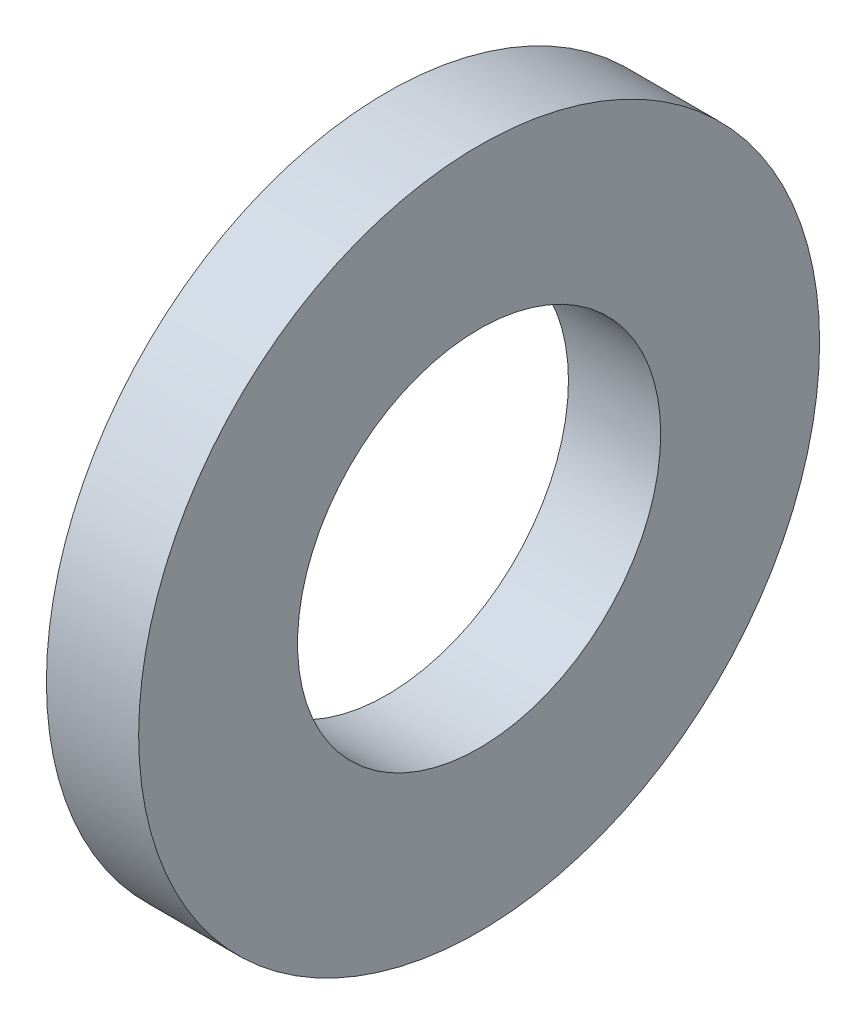
ISO-10303-21;
HEADER;
FILE_DESCRIPTION(('STEP AP214'),'2;1');
FILE_NAME('part.step','',(''),(''),'','','');
FILE_SCHEMA(('AUTOMOTIVE_DESIGN { 1 0 10303 214 1 1 1 1 }'));
ENDSEC;
DATA;
#1=APPLICATION_CONTEXT('core data for automotive mechanical design processes');
#2=APPLICATION_PROTOCOL_DEFINITION('international standard','automotive_design',2000,#1);
#3=PRODUCT_CONTEXT('',#1,'mechanical');
#4=PRODUCT('Part','Part','',(#3));
#5=PRODUCT_RELATED_PRODUCT_CATEGORY('part','',(#4));
#6=PRODUCT_DEFINITION_FORMATION('','',#4);
#7=PRODUCT_DEFINITION_CONTEXT('part definition',#1,'design');
#8=PRODUCT_DEFINITION('design','',#6,#7);
#9=PRODUCT_DEFINITION_SHAPE('','',#8);
#10=(LENGTH_UNIT() NAMED_UNIT(*) SI_UNIT(.MILLI.,.METRE.));
#11=(NAMED_UNIT(*) PLANE_ANGLE_UNIT() SI_UNIT($,.RADIAN.));
#12=(NAMED_UNIT(*) SI_UNIT($,.STERADIAN.) SOLID_ANGLE_UNIT());
#13=UNCERTAINTY_MEASURE_WITH_UNIT(LENGTH_MEASURE(1.E-05),#10,'distance_accuracy_value','');
#14=(GEOMETRIC_REPRESENTATION_CONTEXT(3) GLOBAL_UNCERTAINTY_ASSIGNED_CONTEXT((#13)) GLOBAL_UNIT_ASSIGNED_CONTEXT((#10,
#11,#12)) REPRESENTATION_CONTEXT('',''));
#15=CARTESIAN_POINT('',(0.,0.,0.));
#16=DIRECTION('',(0.,0.,1.));
#17=DIRECTION('',(1.,0.,0.));
#18=AXIS2_PLACEMENT_3D('',#15,#16,#17);
#19=CARTESIAN_POINT('',(0.8128,0.,0.));
#20=DIRECTION('',(1.,0.,0.));
#21=DIRECTION('',(0.,0.,-1.));
#22=AXIS2_PLACEMENT_3D('',#19,#20,#21);
#23=PLANE('',#22);
#24=CARTESIAN_POINT('',(0.8128,0.,0.));
#25=DIRECTION('',(1.,0.,0.));
#26=DIRECTION('',(0.,0.,-1.));
#27=AXIS2_PLACEMENT_3D('',#24,#25,#26);
#28=CIRCLE('',#27,3.);
#29=CARTESIAN_POINT('',(0.8128,0.,-3.));
#30=VERTEX_POINT('',#29);
#31=EDGE_CURVE('E10',#30,#30,#28,.T.);
#32=ORIENTED_EDGE('',*,*,#31,.T.);
#33=EDGE_LOOP('',(#32));
#34=FACE_BOUND('',#33,.T.);
#35=CARTESIAN_POINT('',(0.8128,0.,0.));
#36=DIRECTION('',(1.,0.,0.));
#37=DIRECTION('',(0.,0.,-1.));
#38=AXIS2_PLACEMENT_3D('',#35,#36,#37);
#39=CIRCLE('',#38,1.6);
#40=CARTESIAN_POINT('',(0.8128,0.,-1.6));
#41=VERTEX_POINT('',#40);
#42=EDGE_CURVE('E47',#41,#41,#39,.T.);
#43=ORIENTED_EDGE('',*,*,#42,.F.);
#44=EDGE_LOOP('',(#43));
#45=FACE_BOUND('',#44,.T.);
#46=ADVANCED_FACE('F36',(#34,#45),#23,.T.);
#47=CARTESIAN_POINT('',(0.,0.,0.));
#48=DIRECTION('',(1.,0.,0.));
#49=DIRECTION('',(0.,0.,-1.));
#50=AXIS2_PLACEMENT_3D('',#47,#48,#49);
#51=PLANE('',#50);
#52=CARTESIAN_POINT('',(0.,0.,0.));
#53=DIRECTION('',(1.,0.,0.));
#54=DIRECTION('',(0.,0.,-1.));
#55=AXIS2_PLACEMENT_3D('',#52,#53,#54);
#56=CIRCLE('',#55,3.);
#57=CARTESIAN_POINT('',(0.,0.,-3.));
#58=VERTEX_POINT('',#57);
#59=EDGE_CURVE('E40',#58,#58,#56,.T.);
#60=ORIENTED_EDGE('',*,*,#59,.F.);
#61=EDGE_LOOP('',(#60));
#62=FACE_BOUND('',#61,.T.);
#63=CARTESIAN_POINT('',(0.,0.,0.));
#64=DIRECTION('',(1.,0.,0.));
#65=DIRECTION('',(0.,0.,-1.));
#66=AXIS2_PLACEMENT_3D('',#63,#64,#65);
#67=CIRCLE('',#66,1.6);
#68=CARTESIAN_POINT('',(0.,0.,-1.6));
#69=VERTEX_POINT('',#68);
#70=EDGE_CURVE('E49',#69,#69,#67,.T.);
#71=ORIENTED_EDGE('',*,*,#70,.T.);
#72=EDGE_LOOP('',(#71));
#73=FACE_BOUND('',#72,.T.);
#74=ADVANCED_FACE('F59',(#62,#73),#51,.F.);
#75=CARTESIAN_POINT('',(0.8128,0.,0.));
#76=DIRECTION('',(-1.,0.,0.));
#77=DIRECTION('',(0.,0.,1.));
#78=AXIS2_PLACEMENT_3D('',#75,#76,#77);
#79=CYLINDRICAL_SURFACE('',#78,3.);
#80=ORIENTED_EDGE('',*,*,#31,.F.);
#81=EDGE_LOOP('',(#80));
#82=FACE_BOUND('',#81,.T.);
#83=ORIENTED_EDGE('',*,*,#59,.T.);
#84=EDGE_LOOP('',(#83));
#85=FACE_BOUND('',#84,.T.);
#86=ADVANCED_FACE('F38',(#82,#85),#79,.T.);
#87=CARTESIAN_POINT('',(0.8128,0.,0.));
#88=DIRECTION('',(-1.,0.,0.));
#89=DIRECTION('',(0.,0.,1.));
#90=AXIS2_PLACEMENT_3D('',#87,#88,#89);
#91=CYLINDRICAL_SURFACE('',#90,1.6);
#92=ORIENTED_EDGE('',*,*,#42,.T.);
#93=EDGE_LOOP('',(#92));
#94=FACE_BOUND('',#93,.T.);
#95=ORIENTED_EDGE('',*,*,#70,.F.);
#96=EDGE_LOOP('',(#95));
#97=FACE_BOUND('',#96,.T.);
#98=ADVANCED_FACE('F55',(#94,#97),#91,.F.);
#99=CLOSED_SHELL('',(#46,#74,#86,#98));
#100=MANIFOLD_SOLID_BREP('B2',#99);
#101=ADVANCED_BREP_SHAPE_REPRESENTATION('',(#18,#100),#14);
#102=SHAPE_DEFINITION_REPRESENTATION(#9,#101);
ENDSEC;
END-ISO-10303-21;
